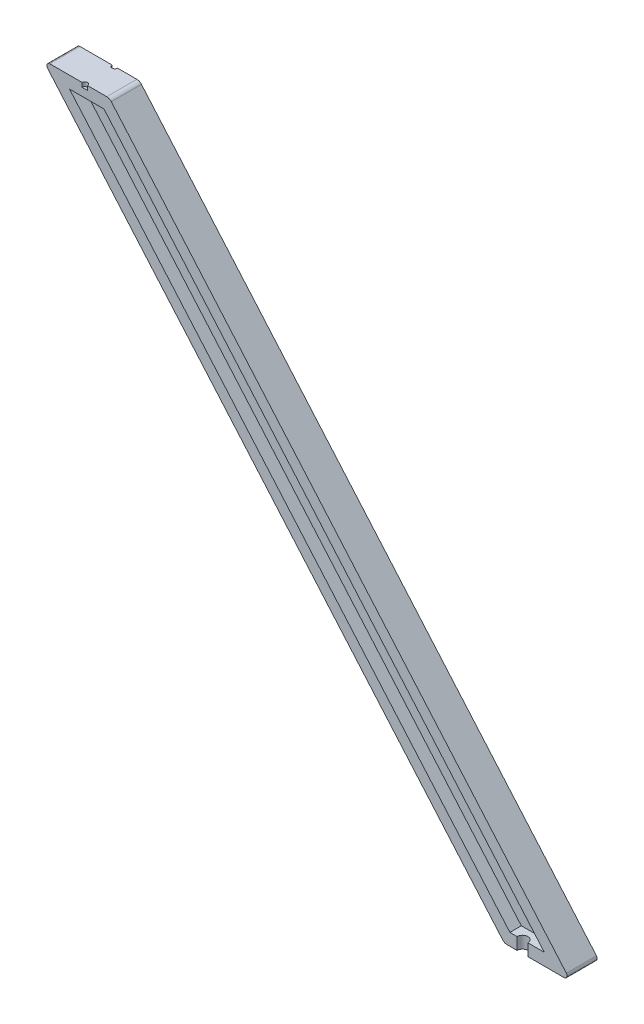
ISO-10303-21;
HEADER;
FILE_DESCRIPTION(('STEP AP214'),'2;1');
FILE_NAME('part.step','',(''),(''),'','','');
FILE_SCHEMA(('AUTOMOTIVE_DESIGN { 1 0 10303 214 1 1 1 1 }'));
ENDSEC;
DATA;
#1=APPLICATION_CONTEXT('core data for automotive mechanical design processes');
#2=APPLICATION_PROTOCOL_DEFINITION('international standard','automotive_design',2000,#1);
#3=PRODUCT_CONTEXT('',#1,'mechanical');
#4=PRODUCT('Part','Part','',(#3));
#5=PRODUCT_RELATED_PRODUCT_CATEGORY('part','',(#4));
#6=PRODUCT_DEFINITION_FORMATION('','',#4);
#7=PRODUCT_DEFINITION_CONTEXT('part definition',#1,'design');
#8=PRODUCT_DEFINITION('design','',#6,#7);
#9=PRODUCT_DEFINITION_SHAPE('','',#8);
#10=(LENGTH_UNIT() NAMED_UNIT(*) SI_UNIT(.MILLI.,.METRE.));
#11=(NAMED_UNIT(*) PLANE_ANGLE_UNIT() SI_UNIT($,.RADIAN.));
#12=(NAMED_UNIT(*) SI_UNIT($,.STERADIAN.) SOLID_ANGLE_UNIT());
#13=UNCERTAINTY_MEASURE_WITH_UNIT(LENGTH_MEASURE(1.E-05),#10,'distance_accuracy_value','');
#14=(GEOMETRIC_REPRESENTATION_CONTEXT(3) GLOBAL_UNCERTAINTY_ASSIGNED_CONTEXT((#13)) GLOBAL_UNIT_ASSIGNED_CONTEXT((#10,
#11,#12)) REPRESENTATION_CONTEXT('',''));
#15=CARTESIAN_POINT('',(0.,0.,0.));
#16=DIRECTION('',(0.,0.,1.));
#17=DIRECTION('',(1.,0.,0.));
#18=AXIS2_PLACEMENT_3D('',#15,#16,#17);
#19=CARTESIAN_POINT('',(-191.698096291734,224.028,12.7));
#20=DIRECTION('',(0.,0.,-1.));
#21=DIRECTION('',(-1.,0.,0.));
#22=AXIS2_PLACEMENT_3D('',#19,#20,#21);
#23=CYLINDRICAL_SURFACE('',#22,1.27000000000001);
#24=CARTESIAN_POINT('',(-191.698096291734,224.028,0.));
#25=DIRECTION('',(0.,0.,1.));
#26=DIRECTION('',(-1.,0.,0.));
#27=AXIS2_PLACEMENT_3D('',#24,#25,#26);
#28=CIRCLE('',#27,1.27000000000001);
#29=CARTESIAN_POINT('',(-191.698096291734,225.298,0.));
#30=VERTEX_POINT('',#29);
#31=CARTESIAN_POINT('',(-192.659480012412,223.198155832933,0.));
#32=VERTEX_POINT('',#31);
#33=EDGE_CURVE('E292',#30,#32,#28,.T.);
#34=ORIENTED_EDGE('',*,*,#33,.T.);
#35=DIRECTION('',(0.,0.,-1.));
#36=VECTOR('',#35,1.);
#37=CARTESIAN_POINT('',(-192.659480012412,223.198155832933,12.7));
#38=LINE('',#37,#36);
#39=CARTESIAN_POINT('',(-192.659480012412,223.198155832933,12.7));
#40=VERTEX_POINT('',#39);
#41=EDGE_CURVE('E256',#40,#32,#38,.T.);
#42=ORIENTED_EDGE('',*,*,#41,.F.);
#43=CARTESIAN_POINT('',(-191.698096291734,224.028,12.7));
#44=DIRECTION('',(0.,0.,1.));
#45=DIRECTION('',(-1.,0.,0.));
#46=AXIS2_PLACEMENT_3D('',#43,#44,#45);
#47=CIRCLE('',#46,1.27000000000001);
#48=CARTESIAN_POINT('',(-191.698096291734,225.298,12.7));
#49=VERTEX_POINT('',#48);
#50=EDGE_CURVE('E235',#49,#40,#47,.T.);
#51=ORIENTED_EDGE('',*,*,#50,.F.);
#52=DIRECTION('',(0.,0.,-1.));
#53=VECTOR('',#52,1.);
#54=CARTESIAN_POINT('',(-191.698096291734,225.298,12.7));
#55=LINE('',#54,#53);
#56=EDGE_CURVE('E236',#49,#30,#55,.T.);
#57=ORIENTED_EDGE('',*,*,#56,.T.);
#58=EDGE_LOOP('',(#34,#42,#51,#57));
#59=FACE_BOUND('',#58,.T.);
#60=ADVANCED_FACE('F36',(#59),#23,.T.);
#61=CARTESIAN_POINT('',(-0.759864646558204,0.880311665865122,12.7));
#62=DIRECTION('',(0.756995055651753,0.65342060399011,0.));
#63=DIRECTION('',(-0.65342060399011,0.756995055651753,0.));
#64=AXIS2_PLACEMENT_3D('',#61,#62,#63);
#65=PLANE('',#64);
#66=DIRECTION('',(0.65342060399011,-0.756995055651753,0.));
#67=VECTOR('',#66,1.);
#68=CARTESIAN_POINT('',(-0.759864646558204,0.880311665865122,0.));
#69=LINE('',#68,#67);
#70=CARTESIAN_POINT('',(-0.759864646558204,0.880311665865122,0.));
#71=VERTEX_POINT('',#70);
#72=EDGE_CURVE('E294',#32,#71,#69,.T.);
#73=ORIENTED_EDGE('',*,*,#72,.T.);
#74=DIRECTION('',(0.,0.,-1.));
#75=VECTOR('',#74,1.);
#76=CARTESIAN_POINT('',(-0.759864646558204,0.880311665865122,12.7));
#77=LINE('',#76,#75);
#78=CARTESIAN_POINT('',(-0.759864646558204,0.880311665865122,12.7));
#79=VERTEX_POINT('',#78);
#80=EDGE_CURVE('E253',#79,#71,#77,.T.);
#81=ORIENTED_EDGE('',*,*,#80,.F.);
#82=DIRECTION('',(0.65342060399011,-0.756995055651753,0.));
#83=VECTOR('',#82,1.);
#84=CARTESIAN_POINT('',(-0.759864646558204,0.880311665865122,12.7));
#85=LINE('',#84,#83);
#86=EDGE_CURVE('E305',#40,#79,#85,.T.);
#87=ORIENTED_EDGE('',*,*,#86,.F.);
#88=ORIENTED_EDGE('',*,*,#41,.T.);
#89=EDGE_LOOP('',(#73,#81,#87,#88));
#90=FACE_BOUND('',#89,.T.);
#91=ADVANCED_FACE('F304',(#90),#65,.F.);
#92=CARTESIAN_POINT('',(1.16290279479725,2.54,12.7));
#93=DIRECTION('',(0.,0.,-1.));
#94=DIRECTION('',(-1.,0.,0.));
#95=AXIS2_PLACEMENT_3D('',#92,#93,#94);
#96=CYLINDRICAL_SURFACE('',#95,2.54);
#97=CARTESIAN_POINT('',(1.16290279479725,2.54,0.));
#98=DIRECTION('',(0.,0.,1.));
#99=DIRECTION('',(-1.,0.,0.));
#100=AXIS2_PLACEMENT_3D('',#97,#98,#99);
#101=CIRCLE('',#100,2.54);
#102=CARTESIAN_POINT('',(1.16290279479725,0.,0.));
#103=VERTEX_POINT('',#102);
#104=EDGE_CURVE('E224',#71,#103,#101,.T.);
#105=ORIENTED_EDGE('',*,*,#104,.T.);
#106=DIRECTION('',(0.,0.,-1.));
#107=VECTOR('',#106,1.);
#108=CARTESIAN_POINT('',(1.16290279479725,0.,12.7));
#109=LINE('',#108,#107);
#110=CARTESIAN_POINT('',(1.16290279479725,0.,12.7));
#111=VERTEX_POINT('',#110);
#112=EDGE_CURVE('E218',#111,#103,#109,.T.);
#113=ORIENTED_EDGE('',*,*,#112,.F.);
#114=CARTESIAN_POINT('',(1.16290279479725,2.54,12.7));
#115=DIRECTION('',(0.,0.,1.));
#116=DIRECTION('',(-1.,0.,0.));
#117=AXIS2_PLACEMENT_3D('',#114,#115,#116);
#118=CIRCLE('',#117,2.54);
#119=EDGE_CURVE('E308',#79,#111,#118,.T.);
#120=ORIENTED_EDGE('',*,*,#119,.F.);
#121=ORIENTED_EDGE('',*,*,#80,.T.);
#122=EDGE_LOOP('',(#105,#113,#120,#121));
#123=FACE_BOUND('',#122,.T.);
#124=ADVANCED_FACE('F299',(#123),#96,.T.);
#125=CARTESIAN_POINT('',(1.16290279479725,0.,12.7));
#126=DIRECTION('',(0.,1.,0.));
#127=DIRECTION('',(0.,0.,1.));
#128=AXIS2_PLACEMENT_3D('',#125,#126,#127);
#129=PLANE('',#128);
#130=DIRECTION('',(1.,0.,0.));
#131=VECTOR('',#130,1.);
#132=CARTESIAN_POINT('',(1.16290279479725,0.,12.7));
#133=LINE('',#132,#131);
#134=CARTESIAN_POINT('',(9.90813535344179,0.,12.7));
#135=VERTEX_POINT('',#134);
#136=CARTESIAN_POINT('',(25.1660794157242,0.,12.7));
#137=VERTEX_POINT('',#136);
#138=EDGE_CURVE('E315',#135,#137,#133,.T.);
#139=ORIENTED_EDGE('',*,*,#138,.F.);
#140=CARTESIAN_POINT('',(7.6221353534418,0.,12.7));
#141=DIRECTION('',(0.,1.,0.));
#142=DIRECTION('',(0.,0.,1.));
#143=AXIS2_PLACEMENT_3D('',#140,#141,#142);
#144=CIRCLE('',#143,2.286);
#145=CARTESIAN_POINT('',(5.3361353534418,0.,12.7));
#146=VERTEX_POINT('',#145);
#147=EDGE_CURVE('E419',#135,#146,#144,.T.);
#148=ORIENTED_EDGE('',*,*,#147,.T.);
#149=EDGE_CURVE('E316',#111,#146,#133,.T.);
#150=ORIENTED_EDGE('',*,*,#149,.F.);
#151=ORIENTED_EDGE('',*,*,#112,.T.);
#152=DIRECTION('',(1.,0.,0.));
#153=VECTOR('',#152,1.);
#154=CARTESIAN_POINT('',(1.16290279479725,0.,0.));
#155=LINE('',#154,#153);
#156=CARTESIAN_POINT('',(5.33613535344179,0.,0.));
#157=VERTEX_POINT('',#156);
#158=EDGE_CURVE('E209',#103,#157,#155,.T.);
#159=ORIENTED_EDGE('',*,*,#158,.T.);
#160=CARTESIAN_POINT('',(7.62213535344179,0.,0.));
#161=DIRECTION('',(0.,1.,0.));
#162=DIRECTION('',(0.,0.,-1.));
#163=AXIS2_PLACEMENT_3D('',#160,#161,#162);
#164=CIRCLE('',#163,2.286);
#165=CARTESIAN_POINT('',(9.90813535344179,0.,0.));
#166=VERTEX_POINT('',#165);
#167=EDGE_CURVE('E194',#157,#166,#164,.T.);
#168=ORIENTED_EDGE('',*,*,#167,.T.);
#169=CARTESIAN_POINT('',(25.1660794157242,0.,0.));
#170=VERTEX_POINT('',#169);
#171=EDGE_CURVE('E220',#166,#170,#155,.T.);
#172=ORIENTED_EDGE('',*,*,#171,.T.);
#173=DIRECTION('',(0.,0.,-1.));
#174=VECTOR('',#173,1.);
#175=CARTESIAN_POINT('',(25.1660794157242,0.,12.7));
#176=LINE('',#175,#174);
#177=EDGE_CURVE('E249',#137,#170,#176,.T.);
#178=ORIENTED_EDGE('',*,*,#177,.F.);
#179=EDGE_LOOP('',(#139,#148,#150,#151,#159,#168,#172,#178));
#180=FACE_BOUND('',#179,.T.);
#181=ADVANCED_FACE('F215',(#180),#129,.F.);
#182=CARTESIAN_POINT('',(25.1660794157242,1.27,12.7));
#183=DIRECTION('',(0.,0.,-1.));
#184=DIRECTION('',(-1.,0.,0.));
#185=AXIS2_PLACEMENT_3D('',#182,#183,#184);
#186=CYLINDRICAL_SURFACE('',#185,1.27);
#187=CARTESIAN_POINT('',(25.1660794157242,1.27,0.));
#188=DIRECTION('',(0.,0.,1.));
#189=DIRECTION('',(1.,0.,0.));
#190=AXIS2_PLACEMENT_3D('',#187,#188,#189);
#191=CIRCLE('',#190,1.27);
#192=CARTESIAN_POINT('',(26.1274631364019,2.09984416706744,0.));
#193=VERTEX_POINT('',#192);
#194=EDGE_CURVE('E219',#170,#193,#191,.T.);
#195=ORIENTED_EDGE('',*,*,#194,.T.);
#196=DIRECTION('',(0.,0.,-1.));
#197=VECTOR('',#196,1.);
#198=CARTESIAN_POINT('',(26.1274631364019,2.09984416706744,12.7));
#199=LINE('',#198,#197);
#200=CARTESIAN_POINT('',(26.1274631364019,2.09984416706744,12.7));
#201=VERTEX_POINT('',#200);
#202=EDGE_CURVE('E246',#201,#193,#199,.T.);
#203=ORIENTED_EDGE('',*,*,#202,.F.);
#204=CARTESIAN_POINT('',(25.1660794157242,1.27,12.7));
#205=DIRECTION('',(0.,0.,1.));
#206=DIRECTION('',(1.,0.,0.));
#207=AXIS2_PLACEMENT_3D('',#204,#205,#206);
#208=CIRCLE('',#207,1.27);
#209=EDGE_CURVE('E318',#137,#201,#208,.T.);
#210=ORIENTED_EDGE('',*,*,#209,.F.);
#211=ORIENTED_EDGE('',*,*,#177,.T.);
#212=EDGE_LOOP('',(#195,#203,#210,#211));
#213=FACE_BOUND('',#212,.T.);
#214=ADVANCED_FACE('F448',(#213),#186,.T.);
#215=CARTESIAN_POINT('',(26.1274631364019,2.09984416706744,12.7));
#216=DIRECTION('',(-0.756995055651753,-0.65342060399011,0.));
#217=DIRECTION('',(0.65342060399011,-0.756995055651753,0.));
#218=AXIS2_PLACEMENT_3D('',#215,#216,#217);
#219=PLANE('',#218);
#220=DIRECTION('',(-0.65342060399011,0.756995055651753,0.));
#221=VECTOR('',#220,1.);
#222=CARTESIAN_POINT('',(26.1274631364019,2.09984416706744,0.));
#223=LINE('',#222,#221);
#224=CARTESIAN_POINT('',(-165.772152229452,224.417688334135,0.));
#225=VERTEX_POINT('',#224);
#226=EDGE_CURVE('E222',#193,#225,#223,.T.);
#227=ORIENTED_EDGE('',*,*,#226,.T.);
#228=DIRECTION('',(0.,0.,-1.));
#229=VECTOR('',#228,1.);
#230=CARTESIAN_POINT('',(-165.772152229452,224.417688334135,12.7));
#231=LINE('',#230,#229);
#232=CARTESIAN_POINT('',(-165.772152229452,224.417688334135,12.7));
#233=VERTEX_POINT('',#232);
#234=EDGE_CURVE('E243',#233,#225,#231,.T.);
#235=ORIENTED_EDGE('',*,*,#234,.F.);
#236=DIRECTION('',(-0.65342060399011,0.756995055651753,0.));
#237=VECTOR('',#236,1.);
#238=CARTESIAN_POINT('',(26.1274631364019,2.09984416706744,12.7));
#239=LINE('',#238,#237);
#240=EDGE_CURVE('E288',#201,#233,#239,.T.);
#241=ORIENTED_EDGE('',*,*,#240,.F.);
#242=ORIENTED_EDGE('',*,*,#202,.T.);
#243=EDGE_LOOP('',(#227,#235,#241,#242));
#244=FACE_BOUND('',#243,.T.);
#245=ADVANCED_FACE('F326',(#244),#219,.F.);
#246=CARTESIAN_POINT('',(-167.694919670807,222.758,12.7));
#247=DIRECTION('',(0.,0.,-1.));
#248=DIRECTION('',(-1.,0.,0.));
#249=AXIS2_PLACEMENT_3D('',#246,#247,#248);
#250=CYLINDRICAL_SURFACE('',#249,2.53999999999998);
#251=CARTESIAN_POINT('',(-167.694919670807,222.758,0.));
#252=DIRECTION('',(0.,0.,1.));
#253=DIRECTION('',(1.,0.,0.));
#254=AXIS2_PLACEMENT_3D('',#251,#252,#253);
#255=CIRCLE('',#254,2.53999999999998);
#256=CARTESIAN_POINT('',(-167.694919670807,225.298,0.));
#257=VERTEX_POINT('',#256);
#258=EDGE_CURVE('E229',#225,#257,#255,.T.);
#259=ORIENTED_EDGE('',*,*,#258,.T.);
#260=DIRECTION('',(0.,0.,-1.));
#261=VECTOR('',#260,1.);
#262=CARTESIAN_POINT('',(-167.694919670807,225.298,12.7));
#263=LINE('',#262,#261);
#264=CARTESIAN_POINT('',(-167.694919670807,225.298,12.7));
#265=VERTEX_POINT('',#264);
#266=EDGE_CURVE('E239',#265,#257,#263,.T.);
#267=ORIENTED_EDGE('',*,*,#266,.F.);
#268=CARTESIAN_POINT('',(-167.694919670807,222.758,12.7));
#269=DIRECTION('',(0.,0.,1.));
#270=DIRECTION('',(1.,0.,0.));
#271=AXIS2_PLACEMENT_3D('',#268,#269,#270);
#272=CIRCLE('',#271,2.53999999999998);
#273=EDGE_CURVE('E286',#233,#265,#272,.T.);
#274=ORIENTED_EDGE('',*,*,#273,.F.);
#275=ORIENTED_EDGE('',*,*,#234,.T.);
#276=EDGE_LOOP('',(#259,#267,#274,#275));
#277=FACE_BOUND('',#276,.T.);
#278=ADVANCED_FACE('F330',(#277),#250,.T.);
#279=CARTESIAN_POINT('',(-167.694919670807,225.298,12.7));
#280=DIRECTION('',(0.,-1.,0.));
#281=DIRECTION('',(0.,0.,-1.));
#282=AXIS2_PLACEMENT_3D('',#279,#280,#281);
#283=PLANE('',#282);
#284=DIRECTION('',(-1.,0.,0.));
#285=VECTOR('',#284,1.);
#286=CARTESIAN_POINT('',(-167.694919670807,225.298,0.));
#287=LINE('',#286,#285);
#288=CARTESIAN_POINT('',(-175.805152229452,225.298,0.));
#289=VERTEX_POINT('',#288);
#290=EDGE_CURVE('E232',#257,#289,#287,.T.);
#291=ORIENTED_EDGE('',*,*,#290,.T.);
#292=CARTESIAN_POINT('',(-176.948152229452,225.298,0.));
#293=DIRECTION('',(0.,-1.,0.));
#294=DIRECTION('',(0.,0.,-1.));
#295=AXIS2_PLACEMENT_3D('',#292,#293,#294);
#296=CIRCLE('',#295,1.14300000000002);
#297=CARTESIAN_POINT('',(-178.091152229452,225.298,0.));
#298=VERTEX_POINT('',#297);
#299=EDGE_CURVE('E360',#289,#298,#296,.T.);
#300=ORIENTED_EDGE('',*,*,#299,.T.);
#301=EDGE_CURVE('E231',#298,#30,#287,.T.);
#302=ORIENTED_EDGE('',*,*,#301,.T.);
#303=ORIENTED_EDGE('',*,*,#56,.F.);
#304=DIRECTION('',(-1.,0.,0.));
#305=VECTOR('',#304,1.);
#306=CARTESIAN_POINT('',(-167.694919670807,225.298,12.7));
#307=LINE('',#306,#305);
#308=CARTESIAN_POINT('',(-178.091152229452,225.298,12.7));
#309=VERTEX_POINT('',#308);
#310=EDGE_CURVE('E275',#309,#49,#307,.T.);
#311=ORIENTED_EDGE('',*,*,#310,.F.);
#312=CARTESIAN_POINT('',(-176.948152229452,225.298,12.7));
#313=DIRECTION('',(0.,-1.,0.));
#314=DIRECTION('',(0.,0.,1.));
#315=AXIS2_PLACEMENT_3D('',#312,#313,#314);
#316=CIRCLE('',#315,1.14300000000002);
#317=CARTESIAN_POINT('',(-175.805152229452,225.298,12.7));
#318=VERTEX_POINT('',#317);
#319=EDGE_CURVE('E283',#309,#318,#316,.T.);
#320=ORIENTED_EDGE('',*,*,#319,.T.);
#321=EDGE_CURVE('E240',#265,#318,#307,.T.);
#322=ORIENTED_EDGE('',*,*,#321,.F.);
#323=ORIENTED_EDGE('',*,*,#266,.T.);
#324=EDGE_LOOP('',(#291,#300,#302,#303,#311,#320,#322,#323));
#325=FACE_BOUND('',#324,.T.);
#326=ADVANCED_FACE('F281',(#325),#283,.F.);
#327=CARTESIAN_POINT('',(-191.698096291734,224.028,12.7));
#328=DIRECTION('',(0.,0.,-1.));
#329=DIRECTION('',(-1.,0.,0.));
#330=AXIS2_PLACEMENT_3D('',#327,#328,#329);
#331=PLANE('',#330);
#332=ORIENTED_EDGE('',*,*,#149,.T.);
#333=DIRECTION('',(0.,1.,0.));
#334=VECTOR('',#333,1.);
#335=CARTESIAN_POINT('',(5.3361353534418,0.,12.7));
#336=LINE('',#335,#334);
#337=CARTESIAN_POINT('',(5.3361353534418,5.08,12.7));
#338=VERTEX_POINT('',#337);
#339=EDGE_CURVE('E335',#146,#338,#336,.T.);
#340=ORIENTED_EDGE('',*,*,#339,.T.);
#341=DIRECTION('',(1.,0.,0.));
#342=VECTOR('',#341,1.);
#343=CARTESIAN_POINT('',(2.32580558959454,5.08,12.7));
#344=LINE('',#343,#342);
#345=CARTESIAN_POINT('',(2.32580558959454,5.08,12.7));
#346=VERTEX_POINT('',#345);
#347=EDGE_CURVE('E396',#346,#338,#344,.T.);
#348=ORIENTED_EDGE('',*,*,#347,.F.);
#349=DIRECTION('',(0.65342060399011,-0.756995055651753,0.));
#350=VECTOR('',#349,1.);
#351=CARTESIAN_POINT('',(-183.376334538907,220.218,12.7));
#352=LINE('',#351,#350);
#353=CARTESIAN_POINT('',(-183.376334538907,220.218,12.7));
#354=VERTEX_POINT('',#353);
#355=EDGE_CURVE('E392',#354,#346,#352,.T.);
#356=ORIENTED_EDGE('',*,*,#355,.F.);
#357=DIRECTION('',(-1.,0.,0.));
#358=VECTOR('',#357,1.);
#359=CARTESIAN_POINT('',(-168.857822465604,220.218,12.7));
#360=LINE('',#359,#358);
#361=CARTESIAN_POINT('',(-168.857822465604,220.218,12.7));
#362=VERTEX_POINT('',#361);
#363=EDGE_CURVE('E371',#362,#354,#360,.T.);
#364=ORIENTED_EDGE('',*,*,#363,.F.);
#365=DIRECTION('',(-0.65342060399011,0.756995055651753,0.));
#366=VECTOR('',#365,1.);
#367=CARTESIAN_POINT('',(16.8443176628966,5.08,12.7));
#368=LINE('',#367,#366);
#369=CARTESIAN_POINT('',(16.8443176628966,5.08,12.7));
#370=VERTEX_POINT('',#369);
#371=EDGE_CURVE('E382',#370,#362,#368,.T.);
#372=ORIENTED_EDGE('',*,*,#371,.F.);
#373=CARTESIAN_POINT('',(9.90813535344179,5.08,12.7));
#374=VERTEX_POINT('',#373);
#375=EDGE_CURVE('E395',#374,#370,#344,.T.);
#376=ORIENTED_EDGE('',*,*,#375,.F.);
#377=DIRECTION('',(0.,1.,0.));
#378=VECTOR('',#377,1.);
#379=CARTESIAN_POINT('',(9.90813535344179,0.,12.7));
#380=LINE('',#379,#378);
#381=EDGE_CURVE('E50',#374,#135,#380,.F.);
#382=ORIENTED_EDGE('',*,*,#381,.T.);
#383=ORIENTED_EDGE('',*,*,#138,.T.);
#384=ORIENTED_EDGE('',*,*,#209,.T.);
#385=ORIENTED_EDGE('',*,*,#240,.T.);
#386=ORIENTED_EDGE('',*,*,#273,.T.);
#387=ORIENTED_EDGE('',*,*,#321,.T.);
#388=DIRECTION('',(0.,-1.,0.));
#389=VECTOR('',#388,1.);
#390=CARTESIAN_POINT('',(-175.805152229452,225.298,12.7));
#391=LINE('',#390,#389);
#392=CARTESIAN_POINT('',(-175.805152229452,223.52,12.7));
#393=VERTEX_POINT('',#392);
#394=EDGE_CURVE('E11',#318,#393,#391,.T.);
#395=ORIENTED_EDGE('',*,*,#394,.T.);
#396=DIRECTION('',(1.,0.,0.));
#397=VECTOR('',#396,1.);
#398=CARTESIAN_POINT('',(-191.698096291734,223.52,12.7));
#399=LINE('',#398,#397);
#400=CARTESIAN_POINT('',(-178.091152229452,223.52,12.7));
#401=VERTEX_POINT('',#400);
#402=EDGE_CURVE('E266',#401,#393,#399,.T.);
#403=ORIENTED_EDGE('',*,*,#402,.F.);
#404=DIRECTION('',(0.,-1.,0.));
#405=VECTOR('',#404,1.);
#406=CARTESIAN_POINT('',(-178.091152229452,225.298,12.7));
#407=LINE('',#406,#405);
#408=EDGE_CURVE('E43',#401,#309,#407,.F.);
#409=ORIENTED_EDGE('',*,*,#408,.T.);
#410=ORIENTED_EDGE('',*,*,#310,.T.);
#411=ORIENTED_EDGE('',*,*,#50,.T.);
#412=ORIENTED_EDGE('',*,*,#86,.T.);
#413=ORIENTED_EDGE('',*,*,#119,.T.);
#414=EDGE_LOOP('',(#332,#340,#348,#356,#364,#372,#376,#382,#383,#384,#385,#386,#387,#395,#403,
#409,#410,#411,#412,#413));
#415=FACE_BOUND('',#414,.T.);
#416=ADVANCED_FACE('F273',(#415),#331,.F.);
#417=CARTESIAN_POINT('',(-191.698096291734,224.028,0.));
#418=DIRECTION('',(0.,0.,-1.));
#419=DIRECTION('',(-1.,0.,0.));
#420=AXIS2_PLACEMENT_3D('',#417,#418,#419);
#421=PLANE('',#420);
#422=DIRECTION('',(0.,1.,0.));
#423=VECTOR('',#422,1.);
#424=CARTESIAN_POINT('',(5.33613535344179,0.,0.));
#425=LINE('',#424,#423);
#426=CARTESIAN_POINT('',(5.33613535344179,5.08,0.));
#427=VERTEX_POINT('',#426);
#428=EDGE_CURVE('E58',#157,#427,#425,.T.);
#429=ORIENTED_EDGE('',*,*,#428,.F.);
#430=ORIENTED_EDGE('',*,*,#158,.F.);
#431=ORIENTED_EDGE('',*,*,#104,.F.);
#432=ORIENTED_EDGE('',*,*,#72,.F.);
#433=ORIENTED_EDGE('',*,*,#33,.F.);
#434=ORIENTED_EDGE('',*,*,#301,.F.);
#435=DIRECTION('',(0.,-1.,0.));
#436=VECTOR('',#435,1.);
#437=CARTESIAN_POINT('',(-178.091152229452,225.298,0.));
#438=LINE('',#437,#436);
#439=CARTESIAN_POINT('',(-178.091152229452,223.52,0.));
#440=VERTEX_POINT('',#439);
#441=EDGE_CURVE('E261',#440,#298,#438,.F.);
#442=ORIENTED_EDGE('',*,*,#441,.F.);
#443=DIRECTION('',(-1.,0.,0.));
#444=VECTOR('',#443,1.);
#445=CARTESIAN_POINT('',(-191.698096291734,223.52,0.));
#446=LINE('',#445,#444);
#447=CARTESIAN_POINT('',(-175.805152229452,223.52,0.));
#448=VERTEX_POINT('',#447);
#449=EDGE_CURVE('E259',#448,#440,#446,.T.);
#450=ORIENTED_EDGE('',*,*,#449,.F.);
#451=DIRECTION('',(0.,-1.,0.));
#452=VECTOR('',#451,1.);
#453=CARTESIAN_POINT('',(-175.805152229452,225.298,0.));
#454=LINE('',#453,#452);
#455=EDGE_CURVE('E263',#289,#448,#454,.T.);
#456=ORIENTED_EDGE('',*,*,#455,.F.);
#457=ORIENTED_EDGE('',*,*,#290,.F.);
#458=ORIENTED_EDGE('',*,*,#258,.F.);
#459=ORIENTED_EDGE('',*,*,#226,.F.);
#460=ORIENTED_EDGE('',*,*,#194,.F.);
#461=ORIENTED_EDGE('',*,*,#171,.F.);
#462=DIRECTION('',(0.,1.,0.));
#463=VECTOR('',#462,1.);
#464=CARTESIAN_POINT('',(9.90813535344179,0.,0.));
#465=LINE('',#464,#463);
#466=CARTESIAN_POINT('',(9.90813535344179,5.08,0.));
#467=VERTEX_POINT('',#466);
#468=EDGE_CURVE('E197',#467,#166,#465,.F.);
#469=ORIENTED_EDGE('',*,*,#468,.F.);
#470=DIRECTION('',(-1.,0.,0.));
#471=VECTOR('',#470,1.);
#472=CARTESIAN_POINT('',(16.8443176628966,5.08,0.));
#473=LINE('',#472,#471);
#474=CARTESIAN_POINT('',(16.8443176628966,5.08,0.));
#475=VERTEX_POINT('',#474);
#476=EDGE_CURVE('E347',#475,#467,#473,.T.);
#477=ORIENTED_EDGE('',*,*,#476,.F.);
#478=DIRECTION('',(0.65342060399011,-0.756995055651753,0.));
#479=VECTOR('',#478,1.);
#480=CARTESIAN_POINT('',(-168.857822465604,220.218,0.));
#481=LINE('',#480,#479);
#482=CARTESIAN_POINT('',(-168.857822465604,220.218,0.));
#483=VERTEX_POINT('',#482);
#484=EDGE_CURVE('E363',#483,#475,#481,.T.);
#485=ORIENTED_EDGE('',*,*,#484,.F.);
#486=DIRECTION('',(1.,0.,0.));
#487=VECTOR('',#486,1.);
#488=CARTESIAN_POINT('',(-183.376334538907,220.218,0.));
#489=LINE('',#488,#487);
#490=CARTESIAN_POINT('',(-183.376334538907,220.218,0.));
#491=VERTEX_POINT('',#490);
#492=EDGE_CURVE('E359',#491,#483,#489,.T.);
#493=ORIENTED_EDGE('',*,*,#492,.F.);
#494=DIRECTION('',(-0.65342060399011,0.756995055651753,0.));
#495=VECTOR('',#494,1.);
#496=CARTESIAN_POINT('',(2.3258055895945,5.08,0.));
#497=LINE('',#496,#495);
#498=CARTESIAN_POINT('',(2.3258055895945,5.08,0.));
#499=VERTEX_POINT('',#498);
#500=EDGE_CURVE('E357',#499,#491,#497,.T.);
#501=ORIENTED_EDGE('',*,*,#500,.F.);
#502=EDGE_CURVE('E211',#427,#499,#473,.T.);
#503=ORIENTED_EDGE('',*,*,#502,.F.);
#504=EDGE_LOOP('',(#429,#430,#431,#432,#433,#434,#442,#450,#456,#457,#458,#459,#460,#461,#469,
#477,#485,#493,#501,#503));
#505=FACE_BOUND('',#504,.T.);
#506=ADVANCED_FACE('F207',(#505),#421,.T.);
#507=CARTESIAN_POINT('',(-168.857822465604,220.218,7.874));
#508=DIRECTION('',(0.,1.,0.));
#509=DIRECTION('',(-1.,0.,0.));
#510=AXIS2_PLACEMENT_3D('',#507,#508,#509);
#511=PLANE('',#510);
#512=ORIENTED_EDGE('',*,*,#363,.T.);
#513=DIRECTION('',(0.,0.,1.));
#514=VECTOR('',#513,1.);
#515=CARTESIAN_POINT('',(-183.376334538907,220.218,7.874));
#516=LINE('',#515,#514);
#517=CARTESIAN_POINT('',(-183.376334538907,220.218,7.874));
#518=VERTEX_POINT('',#517);
#519=EDGE_CURVE('E311',#518,#354,#516,.T.);
#520=ORIENTED_EDGE('',*,*,#519,.F.);
#521=DIRECTION('',(-1.,0.,0.));
#522=VECTOR('',#521,1.);
#523=CARTESIAN_POINT('',(-168.857822465604,220.218,7.874));
#524=LINE('',#523,#522);
#525=CARTESIAN_POINT('',(-168.857822465604,220.218,7.874));
#526=VERTEX_POINT('',#525);
#527=EDGE_CURVE('E378',#526,#518,#524,.T.);
#528=ORIENTED_EDGE('',*,*,#527,.F.);
#529=DIRECTION('',(0.,0.,1.));
#530=VECTOR('',#529,1.);
#531=CARTESIAN_POINT('',(-168.857822465604,220.218,7.874));
#532=LINE('',#531,#530);
#533=EDGE_CURVE('E295',#526,#362,#532,.T.);
#534=ORIENTED_EDGE('',*,*,#533,.T.);
#535=EDGE_LOOP('',(#512,#520,#528,#534));
#536=FACE_BOUND('',#535,.T.);
#537=ADVANCED_FACE('F426',(#536),#511,.F.);
#538=CARTESIAN_POINT('',(16.8443176628966,5.08,7.874));
#539=DIRECTION('',(0.756995055651753,0.65342060399011,0.));
#540=DIRECTION('',(-0.65342060399011,0.756995055651753,0.));
#541=AXIS2_PLACEMENT_3D('',#538,#539,#540);
#542=PLANE('',#541);
#543=ORIENTED_EDGE('',*,*,#371,.T.);
#544=ORIENTED_EDGE('',*,*,#533,.F.);
#545=DIRECTION('',(-0.65342060399011,0.756995055651753,0.));
#546=VECTOR('',#545,1.);
#547=CARTESIAN_POINT('',(16.8443176628966,5.08,7.874));
#548=LINE('',#547,#546);
#549=CARTESIAN_POINT('',(16.8443176628966,5.08,7.874));
#550=VERTEX_POINT('',#549);
#551=EDGE_CURVE('E388',#550,#526,#548,.T.);
#552=ORIENTED_EDGE('',*,*,#551,.F.);
#553=DIRECTION('',(0.,0.,1.));
#554=VECTOR('',#553,1.);
#555=CARTESIAN_POINT('',(16.8443176628966,5.08,7.874));
#556=LINE('',#555,#554);
#557=EDGE_CURVE('E402',#550,#370,#556,.T.);
#558=ORIENTED_EDGE('',*,*,#557,.T.);
#559=EDGE_LOOP('',(#543,#544,#552,#558));
#560=FACE_BOUND('',#559,.T.);
#561=ADVANCED_FACE('F422',(#560),#542,.F.);
#562=CARTESIAN_POINT('',(2.32580558959454,5.08,7.874));
#563=DIRECTION('',(0.,-1.,0.));
#564=DIRECTION('',(0.,0.,-1.));
#565=AXIS2_PLACEMENT_3D('',#562,#563,#564);
#566=PLANE('',#565);
#567=ORIENTED_EDGE('',*,*,#347,.T.);
#568=CARTESIAN_POINT('',(7.6221353534418,5.08,12.7));
#569=DIRECTION('',(0.,1.,0.));
#570=DIRECTION('',(0.,0.,1.));
#571=AXIS2_PLACEMENT_3D('',#568,#569,#570);
#572=CIRCLE('',#571,2.286);
#573=EDGE_CURVE('E201',#374,#338,#572,.T.);
#574=ORIENTED_EDGE('',*,*,#573,.F.);
#575=ORIENTED_EDGE('',*,*,#375,.T.);
#576=ORIENTED_EDGE('',*,*,#557,.F.);
#577=DIRECTION('',(1.,0.,0.));
#578=VECTOR('',#577,1.);
#579=CARTESIAN_POINT('',(2.32580558959454,5.08,7.874));
#580=LINE('',#579,#578);
#581=CARTESIAN_POINT('',(2.32580558959454,5.08,7.874));
#582=VERTEX_POINT('',#581);
#583=EDGE_CURVE('E385',#582,#550,#580,.T.);
#584=ORIENTED_EDGE('',*,*,#583,.F.);
#585=DIRECTION('',(0.,0.,1.));
#586=VECTOR('',#585,1.);
#587=CARTESIAN_POINT('',(2.32580558959454,5.08,7.874));
#588=LINE('',#587,#586);
#589=EDGE_CURVE('E404',#582,#346,#588,.T.);
#590=ORIENTED_EDGE('',*,*,#589,.T.);
#591=EDGE_LOOP('',(#567,#574,#575,#576,#584,#590));
#592=FACE_BOUND('',#591,.T.);
#593=ADVANCED_FACE('F417',(#592),#566,.F.);
#594=CARTESIAN_POINT('',(-183.376334538907,220.218,7.874));
#595=DIRECTION('',(-0.756995055651753,-0.65342060399011,0.));
#596=DIRECTION('',(0.65342060399011,-0.756995055651753,0.));
#597=AXIS2_PLACEMENT_3D('',#594,#595,#596);
#598=PLANE('',#597);
#599=ORIENTED_EDGE('',*,*,#355,.T.);
#600=ORIENTED_EDGE('',*,*,#589,.F.);
#601=DIRECTION('',(0.65342060399011,-0.756995055651753,0.));
#602=VECTOR('',#601,1.);
#603=CARTESIAN_POINT('',(-183.376334538907,220.218,7.874));
#604=LINE('',#603,#602);
#605=EDGE_CURVE('E381',#518,#582,#604,.T.);
#606=ORIENTED_EDGE('',*,*,#605,.F.);
#607=ORIENTED_EDGE('',*,*,#519,.T.);
#608=EDGE_LOOP('',(#599,#600,#606,#607));
#609=FACE_BOUND('',#608,.T.);
#610=ADVANCED_FACE('F411',(#609),#598,.F.);
#611=CARTESIAN_POINT('',(0.,0.,7.874));
#612=DIRECTION('',(0.,0.,1.));
#613=DIRECTION('',(1.,0.,0.));
#614=AXIS2_PLACEMENT_3D('',#611,#612,#613);
#615=PLANE('',#614);
#616=ORIENTED_EDGE('',*,*,#527,.T.);
#617=ORIENTED_EDGE('',*,*,#605,.T.);
#618=ORIENTED_EDGE('',*,*,#583,.T.);
#619=ORIENTED_EDGE('',*,*,#551,.T.);
#620=EDGE_LOOP('',(#616,#617,#618,#619));
#621=FACE_BOUND('',#620,.T.);
#622=ADVANCED_FACE('F425',(#621),#615,.T.);
#623=CARTESIAN_POINT('',(2.3258055895945,5.08,4.826));
#624=DIRECTION('',(-0.756995055651753,-0.65342060399011,0.));
#625=DIRECTION('',(0.65342060399011,-0.756995055651753,0.));
#626=AXIS2_PLACEMENT_3D('',#623,#624,#625);
#627=PLANE('',#626);
#628=ORIENTED_EDGE('',*,*,#500,.T.);
#629=DIRECTION('',(0.,0.,-1.));
#630=VECTOR('',#629,1.);
#631=CARTESIAN_POINT('',(-183.376334538907,220.218,4.826));
#632=LINE('',#631,#630);
#633=CARTESIAN_POINT('',(-183.376334538907,220.218,4.826));
#634=VERTEX_POINT('',#633);
#635=EDGE_CURVE('E356',#634,#491,#632,.T.);
#636=ORIENTED_EDGE('',*,*,#635,.F.);
#637=DIRECTION('',(-0.65342060399011,0.756995055651753,0.));
#638=VECTOR('',#637,1.);
#639=CARTESIAN_POINT('',(2.3258055895945,5.08,4.826));
#640=LINE('',#639,#638);
#641=CARTESIAN_POINT('',(2.3258055895945,5.08,4.826));
#642=VERTEX_POINT('',#641);
#643=EDGE_CURVE('E343',#642,#634,#640,.T.);
#644=ORIENTED_EDGE('',*,*,#643,.F.);
#645=DIRECTION('',(0.,0.,-1.));
#646=VECTOR('',#645,1.);
#647=CARTESIAN_POINT('',(2.3258055895945,5.08,4.826));
#648=LINE('',#647,#646);
#649=EDGE_CURVE('E368',#642,#499,#648,.T.);
#650=ORIENTED_EDGE('',*,*,#649,.T.);
#651=EDGE_LOOP('',(#628,#636,#644,#650));
#652=FACE_BOUND('',#651,.T.);
#653=ADVANCED_FACE('F490',(#652),#627,.F.);
#654=CARTESIAN_POINT('',(16.8443176628966,5.08,4.826));
#655=DIRECTION('',(0.,-1.,0.));
#656=DIRECTION('',(0.,0.,-1.));
#657=AXIS2_PLACEMENT_3D('',#654,#655,#656);
#658=PLANE('',#657);
#659=ORIENTED_EDGE('',*,*,#476,.T.);
#660=CARTESIAN_POINT('',(7.62213535344179,5.08,0.));
#661=DIRECTION('',(0.,1.,0.));
#662=DIRECTION('',(0.,0.,-1.));
#663=AXIS2_PLACEMENT_3D('',#660,#661,#662);
#664=CIRCLE('',#663,2.286);
#665=EDGE_CURVE('E202',#427,#467,#664,.T.);
#666=ORIENTED_EDGE('',*,*,#665,.F.);
#667=ORIENTED_EDGE('',*,*,#502,.T.);
#668=ORIENTED_EDGE('',*,*,#649,.F.);
#669=DIRECTION('',(-1.,0.,0.));
#670=VECTOR('',#669,1.);
#671=CARTESIAN_POINT('',(16.8443176628966,5.08,4.826));
#672=LINE('',#671,#670);
#673=CARTESIAN_POINT('',(16.8443176628966,5.08,4.826));
#674=VERTEX_POINT('',#673);
#675=EDGE_CURVE('E353',#674,#642,#672,.T.);
#676=ORIENTED_EDGE('',*,*,#675,.F.);
#677=DIRECTION('',(0.,0.,-1.));
#678=VECTOR('',#677,1.);
#679=CARTESIAN_POINT('',(16.8443176628966,5.08,4.826));
#680=LINE('',#679,#678);
#681=EDGE_CURVE('E372',#674,#475,#680,.T.);
#682=ORIENTED_EDGE('',*,*,#681,.T.);
#683=EDGE_LOOP('',(#659,#666,#667,#668,#676,#682));
#684=FACE_BOUND('',#683,.T.);
#685=ADVANCED_FACE('F484',(#684),#658,.F.);
#686=CARTESIAN_POINT('',(-168.857822465604,220.218,4.826));
#687=DIRECTION('',(0.756995055651753,0.65342060399011,0.));
#688=DIRECTION('',(-0.65342060399011,0.756995055651753,0.));
#689=AXIS2_PLACEMENT_3D('',#686,#687,#688);
#690=PLANE('',#689);
#691=ORIENTED_EDGE('',*,*,#484,.T.);
#692=ORIENTED_EDGE('',*,*,#681,.F.);
#693=DIRECTION('',(0.65342060399011,-0.756995055651753,0.));
#694=VECTOR('',#693,1.);
#695=CARTESIAN_POINT('',(-168.857822465604,220.218,4.826));
#696=LINE('',#695,#694);
#697=CARTESIAN_POINT('',(-168.857822465604,220.218,4.826));
#698=VERTEX_POINT('',#697);
#699=EDGE_CURVE('E350',#698,#674,#696,.T.);
#700=ORIENTED_EDGE('',*,*,#699,.F.);
#701=DIRECTION('',(0.,0.,-1.));
#702=VECTOR('',#701,1.);
#703=CARTESIAN_POINT('',(-168.857822465604,220.218,4.826));
#704=LINE('',#703,#702);
#705=EDGE_CURVE('E374',#698,#483,#704,.T.);
#706=ORIENTED_EDGE('',*,*,#705,.T.);
#707=EDGE_LOOP('',(#691,#692,#700,#706));
#708=FACE_BOUND('',#707,.T.);
#709=ADVANCED_FACE('F489',(#708),#690,.F.);
#710=CARTESIAN_POINT('',(-183.376334538907,220.218,4.826));
#711=DIRECTION('',(0.,1.,0.));
#712=DIRECTION('',(-1.,0.,0.));
#713=AXIS2_PLACEMENT_3D('',#710,#711,#712);
#714=PLANE('',#713);
#715=ORIENTED_EDGE('',*,*,#492,.T.);
#716=ORIENTED_EDGE('',*,*,#705,.F.);
#717=DIRECTION('',(1.,0.,0.));
#718=VECTOR('',#717,1.);
#719=CARTESIAN_POINT('',(-183.376334538907,220.218,4.826));
#720=LINE('',#719,#718);
#721=EDGE_CURVE('E346',#634,#698,#720,.T.);
#722=ORIENTED_EDGE('',*,*,#721,.F.);
#723=ORIENTED_EDGE('',*,*,#635,.T.);
#724=EDGE_LOOP('',(#715,#716,#722,#723));
#725=FACE_BOUND('',#724,.T.);
#726=ADVANCED_FACE('F533',(#725),#714,.F.);
#727=CARTESIAN_POINT('',(0.,0.,4.826));
#728=DIRECTION('',(0.,0.,-1.));
#729=DIRECTION('',(-1.,0.,0.));
#730=AXIS2_PLACEMENT_3D('',#727,#728,#729);
#731=PLANE('',#730);
#732=ORIENTED_EDGE('',*,*,#643,.T.);
#733=ORIENTED_EDGE('',*,*,#721,.T.);
#734=ORIENTED_EDGE('',*,*,#699,.T.);
#735=ORIENTED_EDGE('',*,*,#675,.T.);
#736=EDGE_LOOP('',(#732,#733,#734,#735));
#737=FACE_BOUND('',#736,.T.);
#738=ADVANCED_FACE('F527',(#737),#731,.T.);
#739=CARTESIAN_POINT('',(-176.948152229452,225.298,0.));
#740=DIRECTION('',(0.,-1.,0.));
#741=DIRECTION('',(0.,0.,-1.));
#742=AXIS2_PLACEMENT_3D('',#739,#740,#741);
#743=CYLINDRICAL_SURFACE('',#742,1.14300000000002);
#744=ORIENTED_EDGE('',*,*,#455,.T.);
#745=CARTESIAN_POINT('',(-176.948152229452,223.52,0.));
#746=DIRECTION('',(0.,-1.,0.));
#747=DIRECTION('',(0.,0.,-1.));
#748=AXIS2_PLACEMENT_3D('',#745,#746,#747);
#749=CIRCLE('',#748,1.14300000000002);
#750=EDGE_CURVE('E337',#448,#440,#749,.T.);
#751=ORIENTED_EDGE('',*,*,#750,.T.);
#752=ORIENTED_EDGE('',*,*,#441,.T.);
#753=ORIENTED_EDGE('',*,*,#299,.F.);
#754=EDGE_LOOP('',(#744,#751,#752,#753));
#755=FACE_BOUND('',#754,.T.);
#756=ADVANCED_FACE('F523',(#755),#743,.F.);
#757=CARTESIAN_POINT('',(-176.948152229452,223.52,0.));
#758=DIRECTION('',(0.,-1.,0.));
#759=DIRECTION('',(0.,0.,-1.));
#760=AXIS2_PLACEMENT_3D('',#757,#758,#759);
#761=PLANE('',#760);
#762=ORIENTED_EDGE('',*,*,#449,.T.);
#763=ORIENTED_EDGE('',*,*,#750,.F.);
#764=EDGE_LOOP('',(#762,#763));
#765=FACE_BOUND('',#764,.T.);
#766=ADVANCED_FACE('F520',(#765),#761,.F.);
#767=CARTESIAN_POINT('',(-176.948152229452,225.298,12.7));
#768=DIRECTION('',(0.,-1.,0.));
#769=DIRECTION('',(0.,0.,-1.));
#770=AXIS2_PLACEMENT_3D('',#767,#768,#769);
#771=CYLINDRICAL_SURFACE('',#770,1.14300000000002);
#772=ORIENTED_EDGE('',*,*,#319,.F.);
#773=ORIENTED_EDGE('',*,*,#408,.F.);
#774=CARTESIAN_POINT('',(-176.948152229452,223.52,12.7));
#775=DIRECTION('',(0.,-1.,0.));
#776=DIRECTION('',(0.,0.,1.));
#777=AXIS2_PLACEMENT_3D('',#774,#775,#776);
#778=CIRCLE('',#777,1.14300000000002);
#779=EDGE_CURVE('E333',#401,#393,#778,.T.);
#780=ORIENTED_EDGE('',*,*,#779,.T.);
#781=ORIENTED_EDGE('',*,*,#394,.F.);
#782=EDGE_LOOP('',(#772,#773,#780,#781));
#783=FACE_BOUND('',#782,.T.);
#784=ADVANCED_FACE('F332',(#783),#771,.F.);
#785=CARTESIAN_POINT('',(-176.948152229452,223.52,12.7));
#786=DIRECTION('',(0.,1.,0.));
#787=DIRECTION('',(0.,0.,1.));
#788=AXIS2_PLACEMENT_3D('',#785,#786,#787);
#789=PLANE('',#788);
#790=ORIENTED_EDGE('',*,*,#402,.T.);
#791=ORIENTED_EDGE('',*,*,#779,.F.);
#792=EDGE_LOOP('',(#790,#791));
#793=FACE_BOUND('',#792,.T.);
#794=ADVANCED_FACE('F505',(#793),#789,.T.);
#795=CARTESIAN_POINT('',(7.62213535344179,0.,0.));
#796=DIRECTION('',(0.,1.,0.));
#797=DIRECTION('',(0.,0.,1.));
#798=AXIS2_PLACEMENT_3D('',#795,#796,#797);
#799=CYLINDRICAL_SURFACE('',#798,2.286);
#800=ORIENTED_EDGE('',*,*,#428,.T.);
#801=ORIENTED_EDGE('',*,*,#665,.T.);
#802=ORIENTED_EDGE('',*,*,#468,.T.);
#803=ORIENTED_EDGE('',*,*,#167,.F.);
#804=EDGE_LOOP('',(#800,#801,#802,#803));
#805=FACE_BOUND('',#804,.T.);
#806=ADVANCED_FACE('F195',(#805),#799,.F.);
#807=CARTESIAN_POINT('',(7.6221353534418,0.,12.7));
#808=DIRECTION('',(0.,1.,0.));
#809=DIRECTION('',(0.,0.,1.));
#810=AXIS2_PLACEMENT_3D('',#807,#808,#809);
#811=CYLINDRICAL_SURFACE('',#810,2.286);
#812=ORIENTED_EDGE('',*,*,#147,.F.);
#813=ORIENTED_EDGE('',*,*,#381,.F.);
#814=ORIENTED_EDGE('',*,*,#573,.T.);
#815=ORIENTED_EDGE('',*,*,#339,.F.);
#816=EDGE_LOOP('',(#812,#813,#814,#815));
#817=FACE_BOUND('',#816,.T.);
#818=ADVANCED_FACE('F504',(#817),#811,.F.);
#819=CLOSED_SHELL('',(#60,#91,#124,#181,#214,#245,#278,#326,#416,#506,#537,#561,#593,#610,#622,
#653,#685,#709,#726,#738,#756,#766,#784,#794,#806,#818));
#820=MANIFOLD_SOLID_BREP('B2',#819);
#821=ADVANCED_BREP_SHAPE_REPRESENTATION('',(#18,#820),#14);
#822=SHAPE_DEFINITION_REPRESENTATION(#9,#821);
ENDSEC;
END-ISO-10303-21;
